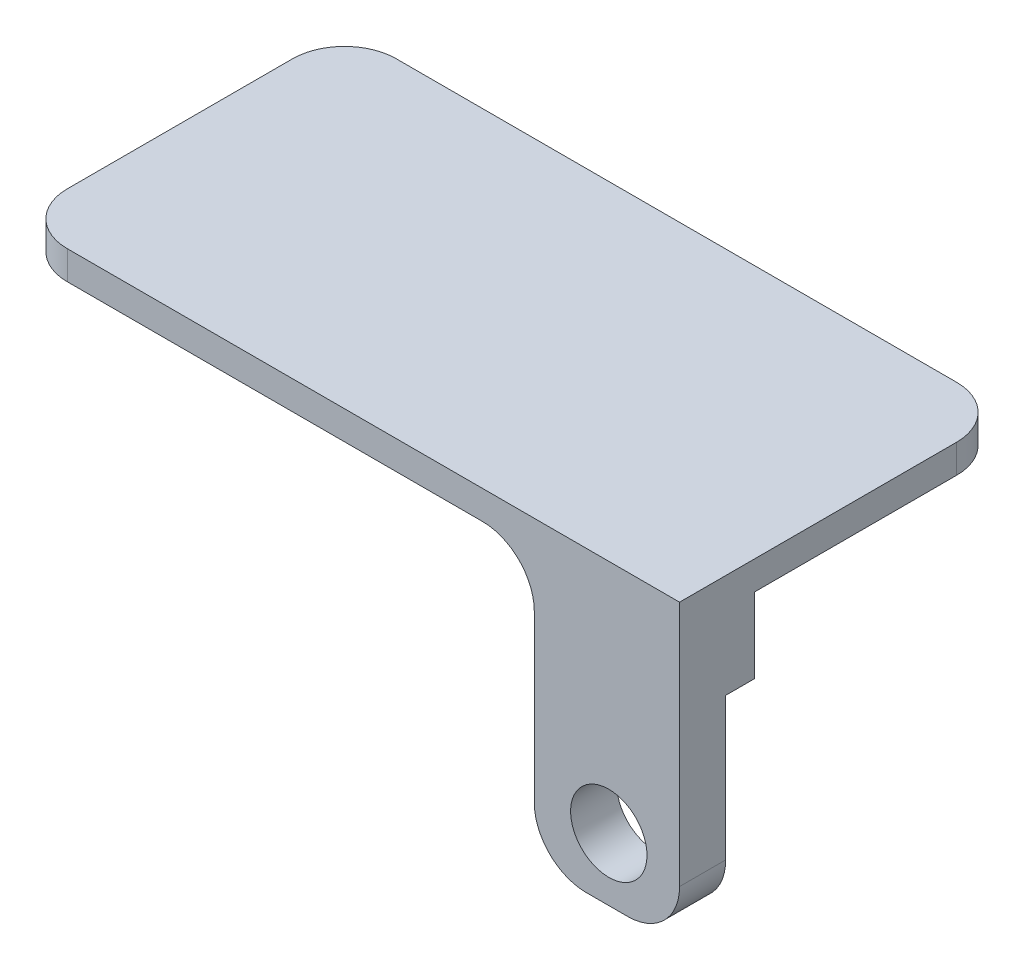
ISO-10303-21;
HEADER;
FILE_DESCRIPTION(('STEP AP214'),'2;1');
FILE_NAME('part.step','',(''),(''),'','','');
FILE_SCHEMA(('AUTOMOTIVE_DESIGN { 1 0 10303 214 1 1 1 1 }'));
ENDSEC;
DATA;
#1=APPLICATION_CONTEXT('core data for automotive mechanical design processes');
#2=APPLICATION_PROTOCOL_DEFINITION('international standard','automotive_design',2000,#1);
#3=PRODUCT_CONTEXT('',#1,'mechanical');
#4=PRODUCT('Part','Part','',(#3));
#5=PRODUCT_RELATED_PRODUCT_CATEGORY('part','',(#4));
#6=PRODUCT_DEFINITION_FORMATION('','',#4);
#7=PRODUCT_DEFINITION_CONTEXT('part definition',#1,'design');
#8=PRODUCT_DEFINITION('design','',#6,#7);
#9=PRODUCT_DEFINITION_SHAPE('','',#8);
#10=(LENGTH_UNIT() NAMED_UNIT(*) SI_UNIT(.MILLI.,.METRE.));
#11=(NAMED_UNIT(*) PLANE_ANGLE_UNIT() SI_UNIT($,.RADIAN.));
#12=(NAMED_UNIT(*) SI_UNIT($,.STERADIAN.) SOLID_ANGLE_UNIT());
#13=UNCERTAINTY_MEASURE_WITH_UNIT(LENGTH_MEASURE(1.E-05),#10,'distance_accuracy_value','');
#14=(GEOMETRIC_REPRESENTATION_CONTEXT(3) GLOBAL_UNCERTAINTY_ASSIGNED_CONTEXT((#13)) GLOBAL_UNIT_ASSIGNED_CONTEXT((#10,
#11,#12)) REPRESENTATION_CONTEXT('',''));
#15=CARTESIAN_POINT('',(0.,0.,0.));
#16=DIRECTION('',(0.,0.,1.));
#17=DIRECTION('',(1.,0.,0.));
#18=AXIS2_PLACEMENT_3D('',#15,#16,#17);
#19=CARTESIAN_POINT('',(-14.,0.,0.));
#20=DIRECTION('',(1.,0.,0.));
#21=DIRECTION('',(0.,0.,-1.));
#22=AXIS2_PLACEMENT_3D('',#19,#20,#21);
#23=PLANE('',#22);
#24=DIRECTION('',(0.,1.,0.));
#25=VECTOR('',#24,1.);
#26=CARTESIAN_POINT('',(-14.,57.2443307684305,-35.560727186157));
#27=LINE('',#26,#25);
#28=CARTESIAN_POINT('',(-14.,62.2443307684305,-35.560727186157));
#29=VERTEX_POINT('',#28);
#30=CARTESIAN_POINT('',(-14.,75.9782577124047,-35.560727186157));
#31=VERTEX_POINT('',#30);
#32=EDGE_CURVE('E141',#29,#31,#27,.T.);
#33=ORIENTED_EDGE('',*,*,#32,.F.);
#34=DIRECTION('',(0.,0.,-1.));
#35=VECTOR('',#34,1.);
#36=CARTESIAN_POINT('',(-14.,62.2443307684305,-31.1164269881325));
#37=LINE('',#36,#35);
#38=CARTESIAN_POINT('',(-14.,62.2443307684305,-31.1164269881325));
#39=VERTEX_POINT('',#38);
#40=EDGE_CURVE('E54',#29,#39,#37,.F.);
#41=ORIENTED_EDGE('',*,*,#40,.T.);
#42=DIRECTION('',(0.,-1.,0.));
#43=VECTOR('',#42,1.);
#44=CARTESIAN_POINT('',(-14.,85.9782577124047,-31.1164269881325));
#45=LINE('',#44,#43);
#46=CARTESIAN_POINT('',(-14.,78.2163658498492,-31.1164269881325));
#47=VERTEX_POINT('',#46);
#48=EDGE_CURVE('E163',#47,#39,#45,.T.);
#49=ORIENTED_EDGE('',*,*,#48,.F.);
#50=DIRECTION('',(0.,0.,1.));
#51=VECTOR('',#50,1.);
#52=CARTESIAN_POINT('',(-14.,78.2163658498492,0.));
#53=LINE('',#52,#51);
#54=CARTESIAN_POINT('',(-14.,78.2163658498492,-38.3498512377335));
#55=VERTEX_POINT('',#54);
#56=EDGE_CURVE('E48',#47,#55,#53,.F.);
#57=ORIENTED_EDGE('',*,*,#56,.T.);
#58=DIRECTION('',(0.,1.,0.));
#59=VECTOR('',#58,1.);
#60=CARTESIAN_POINT('',(-14.,75.9782577124047,-38.3498512377335));
#61=LINE('',#60,#59);
#62=CARTESIAN_POINT('',(-14.,75.9782577124047,-38.3498512377335));
#63=VERTEX_POINT('',#62);
#64=EDGE_CURVE('E161',#63,#55,#61,.T.);
#65=ORIENTED_EDGE('',*,*,#64,.F.);
#66=DIRECTION('',(0.,0.,-1.));
#67=VECTOR('',#66,1.);
#68=CARTESIAN_POINT('',(-14.,75.9782577124047,-35.560727186157));
#69=LINE('',#68,#67);
#70=EDGE_CURVE('E150',#31,#63,#69,.T.);
#71=ORIENTED_EDGE('',*,*,#70,.F.);
#72=EDGE_LOOP('',(#33,#41,#49,#57,#65,#71));
#73=FACE_BOUND('',#72,.T.);
#74=ADVANCED_FACE('F33',(#73),#23,.F.);
#75=CARTESIAN_POINT('',(-14.,57.2443307684305,-35.560727186157));
#76=DIRECTION('',(0.,-1.,0.));
#77=DIRECTION('',(0.,0.,-1.));
#78=AXIS2_PLACEMENT_3D('',#75,#76,#77);
#79=PLANE('',#78);
#80=DIRECTION('',(1.,0.,0.));
#81=VECTOR('',#80,1.);
#82=CARTESIAN_POINT('',(-14.,57.2443307684305,-35.560727186157));
#83=LINE('',#82,#81);
#84=CARTESIAN_POINT('',(-9.,57.2443307684305,-35.560727186157));
#85=VERTEX_POINT('',#84);
#86=CARTESIAN_POINT('',(-5.,57.2443307684305,-35.560727186157));
#87=VERTEX_POINT('',#86);
#88=EDGE_CURVE('E159',#85,#87,#83,.T.);
#89=ORIENTED_EDGE('',*,*,#88,.T.);
#90=DIRECTION('',(0.,0.,-1.));
#91=VECTOR('',#90,1.);
#92=CARTESIAN_POINT('',(-5.,57.2443307684305,-35.560727186157));
#93=LINE('',#92,#91);
#94=CARTESIAN_POINT('',(-5.,57.2443307684305,-31.1164269881325));
#95=VERTEX_POINT('',#94);
#96=EDGE_CURVE('E174',#87,#95,#93,.F.);
#97=ORIENTED_EDGE('',*,*,#96,.T.);
#98=DIRECTION('',(1.,0.,0.));
#99=VECTOR('',#98,1.);
#100=CARTESIAN_POINT('',(-14.,57.2443307684305,-31.1164269881325));
#101=LINE('',#100,#99);
#102=CARTESIAN_POINT('',(-9.,57.2443307684305,-31.1164269881325));
#103=VERTEX_POINT('',#102);
#104=EDGE_CURVE('E254',#103,#95,#101,.T.);
#105=ORIENTED_EDGE('',*,*,#104,.F.);
#106=DIRECTION('',(0.,0.,-1.));
#107=VECTOR('',#106,1.);
#108=CARTESIAN_POINT('',(-9.,57.2443307684305,-35.560727186157));
#109=LINE('',#108,#107);
#110=EDGE_CURVE('E247',#103,#85,#109,.T.);
#111=ORIENTED_EDGE('',*,*,#110,.T.);
#112=EDGE_LOOP('',(#89,#97,#105,#111));
#113=FACE_BOUND('',#112,.T.);
#114=ADVANCED_FACE('F253',(#113),#79,.T.);
#115=CARTESIAN_POINT('',(-14.,85.9782577124047,-31.1164269881325));
#116=DIRECTION('',(0.,0.,1.));
#117=DIRECTION('',(1.,0.,0.));
#118=AXIS2_PLACEMENT_3D('',#115,#116,#117);
#119=PLANE('',#118);
#120=CARTESIAN_POINT('',(-6.81927464086296,63.2782577124047,-31.1164269881325));
#121=DIRECTION('',(0.,0.,1.));
#122=DIRECTION('',(1.,0.,0.));
#123=AXIS2_PLACEMENT_3D('',#120,#121,#122);
#124=CIRCLE('',#123,3.67999999999998);
#125=CARTESIAN_POINT('',(-3.13927464086298,63.2782577124047,-31.1164269881325));
#126=VERTEX_POINT('',#125);
#127=EDGE_CURVE('E213',#126,#126,#124,.T.);
#128=ORIENTED_EDGE('',*,*,#127,.F.);
#129=EDGE_LOOP('',(#128));
#130=FACE_BOUND('',#129,.T.);
#131=ORIENTED_EDGE('',*,*,#104,.T.);
#132=CARTESIAN_POINT('',(-5.,62.2443307684305,-31.1164269881325));
#133=DIRECTION('',(0.,0.,1.));
#134=DIRECTION('',(1.,0.,0.));
#135=AXIS2_PLACEMENT_3D('',#132,#133,#134);
#136=CIRCLE('',#135,5.);
#137=CARTESIAN_POINT('',(0.,62.2443307684305,-31.1164269881325));
#138=VERTEX_POINT('',#137);
#139=EDGE_CURVE('E180',#95,#138,#136,.T.);
#140=ORIENTED_EDGE('',*,*,#139,.T.);
#141=DIRECTION('',(0.,-1.,0.));
#142=VECTOR('',#141,1.);
#143=CARTESIAN_POINT('',(0.,85.9782577124047,-31.1164269881325));
#144=LINE('',#143,#142);
#145=CARTESIAN_POINT('',(0.,85.9782577124047,-31.1164269881325));
#146=VERTEX_POINT('',#145);
#147=EDGE_CURVE('E151',#146,#138,#144,.T.);
#148=ORIENTED_EDGE('',*,*,#147,.F.);
#149=DIRECTION('',(1.,0.,0.));
#150=VECTOR('',#149,1.);
#151=CARTESIAN_POINT('',(-14.,85.9782577124047,-31.1164269881325));
#152=LINE('',#151,#150);
#153=CARTESIAN_POINT('',(-59.,85.9782577124047,-31.1164269881325));
#154=VERTEX_POINT('',#153);
#155=EDGE_CURVE('E260',#154,#146,#152,.T.);
#156=ORIENTED_EDGE('',*,*,#155,.F.);
#157=DIRECTION('',(0.,1.,0.));
#158=VECTOR('',#157,1.);
#159=CARTESIAN_POINT('',(-59.,83.2163658498492,-31.1164269881325));
#160=LINE('',#159,#158);
#161=CARTESIAN_POINT('',(-59.,83.2163658498492,-31.1164269881325));
#162=VERTEX_POINT('',#161);
#163=EDGE_CURVE('E176',#154,#162,#160,.F.);
#164=ORIENTED_EDGE('',*,*,#163,.T.);
#165=DIRECTION('',(1.,0.,0.));
#166=VECTOR('',#165,1.);
#167=CARTESIAN_POINT('',(-64.,83.2163658498492,-31.1164269881325));
#168=LINE('',#167,#166);
#169=CARTESIAN_POINT('',(-19.,83.2163658498492,-31.1164269881325));
#170=VERTEX_POINT('',#169);
#171=EDGE_CURVE('E189',#162,#170,#168,.T.);
#172=ORIENTED_EDGE('',*,*,#171,.T.);
#173=CARTESIAN_POINT('',(-19.,78.2163658498492,-31.1164269881325));
#174=DIRECTION('',(0.,0.,1.));
#175=DIRECTION('',(1.,0.,0.));
#176=AXIS2_PLACEMENT_3D('',#173,#174,#175);
#177=CIRCLE('',#176,5.);
#178=EDGE_CURVE('E41',#170,#47,#177,.F.);
#179=ORIENTED_EDGE('',*,*,#178,.T.);
#180=ORIENTED_EDGE('',*,*,#48,.T.);
#181=CARTESIAN_POINT('',(-9.,62.2443307684305,-31.1164269881325));
#182=DIRECTION('',(0.,0.,1.));
#183=DIRECTION('',(1.,0.,0.));
#184=AXIS2_PLACEMENT_3D('',#181,#182,#183);
#185=CIRCLE('',#184,5.);
#186=EDGE_CURVE('E178',#39,#103,#185,.T.);
#187=ORIENTED_EDGE('',*,*,#186,.T.);
#188=EDGE_LOOP('',(#131,#140,#148,#156,#164,#172,#179,#180,#187));
#189=FACE_BOUND('',#188,.T.);
#190=ADVANCED_FACE('F186',(#130,#189),#119,.T.);
#191=CARTESIAN_POINT('',(-14.,85.9782577124047,-62.8189346250314));
#192=DIRECTION('',(0.,1.,0.));
#193=DIRECTION('',(0.,0.,1.));
#194=AXIS2_PLACEMENT_3D('',#191,#192,#193);
#195=PLANE('',#194);
#196=DIRECTION('',(1.,0.,0.));
#197=VECTOR('',#196,1.);
#198=CARTESIAN_POINT('',(-14.,85.9782577124047,-62.8189346250314));
#199=LINE('',#198,#197);
#200=CARTESIAN_POINT('',(-59.,85.9782577124047,-62.8189346250314));
#201=VERTEX_POINT('',#200);
#202=CARTESIAN_POINT('',(-5.,85.9782577124047,-62.8189346250314));
#203=VERTEX_POINT('',#202);
#204=EDGE_CURVE('E275',#201,#203,#199,.T.);
#205=ORIENTED_EDGE('',*,*,#204,.F.);
#206=CARTESIAN_POINT('',(-59.,85.9782577124047,-57.8189346250314));
#207=DIRECTION('',(0.,1.,0.));
#208=DIRECTION('',(0.,0.,1.));
#209=AXIS2_PLACEMENT_3D('',#206,#207,#208);
#210=CIRCLE('',#209,5.);
#211=CARTESIAN_POINT('',(-64.,85.9782577124047,-57.8189346250314));
#212=VERTEX_POINT('',#211);
#213=EDGE_CURVE('E237',#201,#212,#210,.T.);
#214=ORIENTED_EDGE('',*,*,#213,.T.);
#215=DIRECTION('',(0.,0.,-1.));
#216=VECTOR('',#215,1.);
#217=CARTESIAN_POINT('',(-64.,85.9782577124047,-31.1164269881325));
#218=LINE('',#217,#216);
#219=CARTESIAN_POINT('',(-64.,85.9782577124047,-36.1164269881325));
#220=VERTEX_POINT('',#219);
#221=EDGE_CURVE('E307',#220,#212,#218,.T.);
#222=ORIENTED_EDGE('',*,*,#221,.F.);
#223=CARTESIAN_POINT('',(-59.,85.9782577124047,-36.1164269881325));
#224=DIRECTION('',(0.,1.,0.));
#225=DIRECTION('',(0.,0.,1.));
#226=AXIS2_PLACEMENT_3D('',#223,#224,#225);
#227=CIRCLE('',#226,5.);
#228=EDGE_CURVE('E233',#220,#154,#227,.T.);
#229=ORIENTED_EDGE('',*,*,#228,.T.);
#230=ORIENTED_EDGE('',*,*,#155,.T.);
#231=DIRECTION('',(0.,0.,1.));
#232=VECTOR('',#231,1.);
#233=CARTESIAN_POINT('',(0.,85.9782577124047,-62.8189346250314));
#234=LINE('',#233,#232);
#235=CARTESIAN_POINT('',(0.,85.9782577124047,-57.8189346250314));
#236=VERTEX_POINT('',#235);
#237=EDGE_CURVE('E272',#236,#146,#234,.T.);
#238=ORIENTED_EDGE('',*,*,#237,.F.);
#239=CARTESIAN_POINT('',(-5.,85.9782577124047,-57.8189346250314));
#240=DIRECTION('',(0.,1.,0.));
#241=DIRECTION('',(0.,0.,1.));
#242=AXIS2_PLACEMENT_3D('',#239,#240,#241);
#243=CIRCLE('',#242,5.);
#244=EDGE_CURVE('E235',#236,#203,#243,.T.);
#245=ORIENTED_EDGE('',*,*,#244,.T.);
#246=EDGE_LOOP('',(#205,#214,#222,#229,#230,#238,#245));
#247=FACE_BOUND('',#246,.T.);
#248=ADVANCED_FACE('F292',(#247),#195,.T.);
#249=CARTESIAN_POINT('',(-14.,83.2163658498492,-62.8189346250314));
#250=DIRECTION('',(0.,0.,-1.));
#251=DIRECTION('',(-1.,0.,0.));
#252=AXIS2_PLACEMENT_3D('',#249,#250,#251);
#253=PLANE('',#252);
#254=DIRECTION('',(1.,0.,0.));
#255=VECTOR('',#254,1.);
#256=CARTESIAN_POINT('',(-14.,83.2163658498492,-62.8189346250314));
#257=LINE('',#256,#255);
#258=CARTESIAN_POINT('',(-59.,83.2163658498492,-62.8189346250314));
#259=VERTEX_POINT('',#258);
#260=CARTESIAN_POINT('',(-5.,83.2163658498492,-62.8189346250314));
#261=VERTEX_POINT('',#260);
#262=EDGE_CURVE('E203',#259,#261,#257,.T.);
#263=ORIENTED_EDGE('',*,*,#262,.F.);
#264=DIRECTION('',(0.,-1.,0.));
#265=VECTOR('',#264,1.);
#266=CARTESIAN_POINT('',(-59.,85.9782577124047,-62.8189346250314));
#267=LINE('',#266,#265);
#268=EDGE_CURVE('E231',#259,#201,#267,.F.);
#269=ORIENTED_EDGE('',*,*,#268,.T.);
#270=ORIENTED_EDGE('',*,*,#204,.T.);
#271=DIRECTION('',(0.,1.,0.));
#272=VECTOR('',#271,1.);
#273=CARTESIAN_POINT('',(-5.,83.2163658498492,-62.8189346250314));
#274=LINE('',#273,#272);
#275=EDGE_CURVE('E229',#203,#261,#274,.F.);
#276=ORIENTED_EDGE('',*,*,#275,.T.);
#277=EDGE_LOOP('',(#263,#269,#270,#276));
#278=FACE_BOUND('',#277,.T.);
#279=ADVANCED_FACE('F321',(#278),#253,.T.);
#280=CARTESIAN_POINT('',(-14.,83.2163658498492,-38.3498512377335));
#281=DIRECTION('',(0.,-1.,0.));
#282=DIRECTION('',(0.,0.,-1.));
#283=AXIS2_PLACEMENT_3D('',#280,#281,#282);
#284=PLANE('',#283);
#285=DIRECTION('',(0.,0.,1.));
#286=VECTOR('',#285,1.);
#287=CARTESIAN_POINT('',(-64.,83.2163658498492,-31.1164269881325));
#288=LINE('',#287,#286);
#289=CARTESIAN_POINT('',(-64.,83.2163658498492,-57.8189346250314));
#290=VERTEX_POINT('',#289);
#291=CARTESIAN_POINT('',(-64.,83.2163658498492,-36.1164269881325));
#292=VERTEX_POINT('',#291);
#293=EDGE_CURVE('E219',#290,#292,#288,.T.);
#294=ORIENTED_EDGE('',*,*,#293,.F.);
#295=CARTESIAN_POINT('',(-59.,83.2163658498492,-57.8189346250314));
#296=DIRECTION('',(0.,-1.,0.));
#297=DIRECTION('',(0.,0.,-1.));
#298=AXIS2_PLACEMENT_3D('',#295,#296,#297);
#299=CIRCLE('',#298,5.);
#300=EDGE_CURVE('E227',#290,#259,#299,.T.);
#301=ORIENTED_EDGE('',*,*,#300,.T.);
#302=ORIENTED_EDGE('',*,*,#262,.T.);
#303=CARTESIAN_POINT('',(-5.,83.2163658498492,-57.8189346250314));
#304=DIRECTION('',(0.,-1.,0.));
#305=DIRECTION('',(0.,0.,-1.));
#306=AXIS2_PLACEMENT_3D('',#303,#304,#305);
#307=CIRCLE('',#306,5.);
#308=CARTESIAN_POINT('',(0.,83.2163658498492,-57.8189346250314));
#309=VERTEX_POINT('',#308);
#310=EDGE_CURVE('E225',#261,#309,#307,.T.);
#311=ORIENTED_EDGE('',*,*,#310,.T.);
#312=DIRECTION('',(0.,0.,-1.));
#313=VECTOR('',#312,1.);
#314=CARTESIAN_POINT('',(0.,83.2163658498492,-38.3498512377335));
#315=LINE('',#314,#313);
#316=CARTESIAN_POINT('',(0.,83.2163658498492,-38.3498512377335));
#317=VERTEX_POINT('',#316);
#318=EDGE_CURVE('E268',#317,#309,#315,.T.);
#319=ORIENTED_EDGE('',*,*,#318,.F.);
#320=DIRECTION('',(1.,0.,0.));
#321=VECTOR('',#320,1.);
#322=CARTESIAN_POINT('',(-14.,83.2163658498492,-38.3498512377335));
#323=LINE('',#322,#321);
#324=CARTESIAN_POINT('',(-19.,83.2163658498492,-38.3498512377335));
#325=VERTEX_POINT('',#324);
#326=EDGE_CURVE('E198',#325,#317,#323,.T.);
#327=ORIENTED_EDGE('',*,*,#326,.F.);
#328=DIRECTION('',(0.,0.,1.));
#329=VECTOR('',#328,1.);
#330=CARTESIAN_POINT('',(-19.,83.2163658498492,-38.3498512377335));
#331=LINE('',#330,#329);
#332=EDGE_CURVE('E194',#325,#170,#331,.T.);
#333=ORIENTED_EDGE('',*,*,#332,.T.);
#334=ORIENTED_EDGE('',*,*,#171,.F.);
#335=CARTESIAN_POINT('',(-59.,83.2163658498492,-36.1164269881325));
#336=DIRECTION('',(0.,-1.,0.));
#337=DIRECTION('',(0.,0.,-1.));
#338=AXIS2_PLACEMENT_3D('',#335,#336,#337);
#339=CIRCLE('',#338,5.);
#340=EDGE_CURVE('E223',#162,#292,#339,.T.);
#341=ORIENTED_EDGE('',*,*,#340,.T.);
#342=EDGE_LOOP('',(#294,#301,#302,#311,#319,#327,#333,#334,#341));
#343=FACE_BOUND('',#342,.T.);
#344=ADVANCED_FACE('F285',(#343),#284,.T.);
#345=CARTESIAN_POINT('',(-14.,75.9782577124047,-38.3498512377335));
#346=DIRECTION('',(0.,0.,-1.));
#347=DIRECTION('',(-1.,0.,0.));
#348=AXIS2_PLACEMENT_3D('',#345,#346,#347);
#349=PLANE('',#348);
#350=DIRECTION('',(0.,1.,0.));
#351=VECTOR('',#350,1.);
#352=CARTESIAN_POINT('',(0.,75.9782577124047,-38.3498512377335));
#353=LINE('',#352,#351);
#354=CARTESIAN_POINT('',(0.,75.9782577124047,-38.3498512377335));
#355=VERTEX_POINT('',#354);
#356=EDGE_CURVE('E201',#355,#317,#353,.T.);
#357=ORIENTED_EDGE('',*,*,#356,.F.);
#358=DIRECTION('',(1.,0.,0.));
#359=VECTOR('',#358,1.);
#360=CARTESIAN_POINT('',(-14.,75.9782577124047,-38.3498512377335));
#361=LINE('',#360,#359);
#362=EDGE_CURVE('E158',#63,#355,#361,.T.);
#363=ORIENTED_EDGE('',*,*,#362,.F.);
#364=ORIENTED_EDGE('',*,*,#64,.T.);
#365=CARTESIAN_POINT('',(-19.,78.2163658498492,-38.3498512377335));
#366=DIRECTION('',(0.,0.,-1.));
#367=DIRECTION('',(-1.,0.,0.));
#368=AXIS2_PLACEMENT_3D('',#365,#366,#367);
#369=CIRCLE('',#368,5.);
#370=EDGE_CURVE('E11',#55,#325,#369,.F.);
#371=ORIENTED_EDGE('',*,*,#370,.T.);
#372=ORIENTED_EDGE('',*,*,#326,.T.);
#373=EDGE_LOOP('',(#357,#363,#364,#371,#372));
#374=FACE_BOUND('',#373,.T.);
#375=ADVANCED_FACE('F197',(#374),#349,.T.);
#376=CARTESIAN_POINT('',(-14.,75.9782577124047,-35.560727186157));
#377=DIRECTION('',(0.,-1.,0.));
#378=DIRECTION('',(0.,0.,-1.));
#379=AXIS2_PLACEMENT_3D('',#376,#377,#378);
#380=PLANE('',#379);
#381=DIRECTION('',(0.,0.,-1.));
#382=VECTOR('',#381,1.);
#383=CARTESIAN_POINT('',(0.,75.9782577124047,-35.560727186157));
#384=LINE('',#383,#382);
#385=CARTESIAN_POINT('',(0.,75.9782577124047,-35.560727186157));
#386=VERTEX_POINT('',#385);
#387=EDGE_CURVE('E157',#386,#355,#384,.T.);
#388=ORIENTED_EDGE('',*,*,#387,.F.);
#389=DIRECTION('',(1.,0.,0.));
#390=VECTOR('',#389,1.);
#391=CARTESIAN_POINT('',(-14.,75.9782577124047,-35.560727186157));
#392=LINE('',#391,#390);
#393=EDGE_CURVE('E145',#31,#386,#392,.T.);
#394=ORIENTED_EDGE('',*,*,#393,.F.);
#395=ORIENTED_EDGE('',*,*,#70,.T.);
#396=ORIENTED_EDGE('',*,*,#362,.T.);
#397=EDGE_LOOP('',(#388,#394,#395,#396));
#398=FACE_BOUND('',#397,.T.);
#399=ADVANCED_FACE('F155',(#398),#380,.T.);
#400=CARTESIAN_POINT('',(-14.,57.2443307684305,-35.560727186157));
#401=DIRECTION('',(0.,0.,-1.));
#402=DIRECTION('',(-1.,0.,0.));
#403=AXIS2_PLACEMENT_3D('',#400,#401,#402);
#404=PLANE('',#403);
#405=CARTESIAN_POINT('',(-6.81927464086296,63.2782577124047,-35.560727186157));
#406=DIRECTION('',(0.,0.,-1.));
#407=DIRECTION('',(-1.,0.,0.));
#408=AXIS2_PLACEMENT_3D('',#405,#406,#407);
#409=CIRCLE('',#408,3.67999999999998);
#410=CARTESIAN_POINT('',(-10.4992746408629,63.2782577124047,-35.560727186157));
#411=VERTEX_POINT('',#410);
#412=EDGE_CURVE('E210',#411,#411,#409,.T.);
#413=ORIENTED_EDGE('',*,*,#412,.F.);
#414=EDGE_LOOP('',(#413));
#415=FACE_BOUND('',#414,.T.);
#416=DIRECTION('',(0.,1.,0.));
#417=VECTOR('',#416,1.);
#418=CARTESIAN_POINT('',(0.,57.2443307684305,-35.560727186157));
#419=LINE('',#418,#417);
#420=CARTESIAN_POINT('',(0.,62.2443307684305,-35.560727186157));
#421=VERTEX_POINT('',#420);
#422=EDGE_CURVE('E169',#421,#386,#419,.T.);
#423=ORIENTED_EDGE('',*,*,#422,.F.);
#424=CARTESIAN_POINT('',(-5.,62.2443307684305,-35.560727186157));
#425=DIRECTION('',(0.,0.,-1.));
#426=DIRECTION('',(-1.,0.,0.));
#427=AXIS2_PLACEMENT_3D('',#424,#425,#426);
#428=CIRCLE('',#427,5.);
#429=EDGE_CURVE('E246',#421,#87,#428,.T.);
#430=ORIENTED_EDGE('',*,*,#429,.T.);
#431=ORIENTED_EDGE('',*,*,#88,.F.);
#432=CARTESIAN_POINT('',(-9.,62.2443307684305,-35.560727186157));
#433=DIRECTION('',(0.,0.,-1.));
#434=DIRECTION('',(-1.,0.,0.));
#435=AXIS2_PLACEMENT_3D('',#432,#433,#434);
#436=CIRCLE('',#435,5.);
#437=EDGE_CURVE('E148',#85,#29,#436,.T.);
#438=ORIENTED_EDGE('',*,*,#437,.T.);
#439=ORIENTED_EDGE('',*,*,#32,.T.);
#440=ORIENTED_EDGE('',*,*,#393,.T.);
#441=EDGE_LOOP('',(#423,#430,#431,#438,#439,#440));
#442=FACE_BOUND('',#441,.T.);
#443=ADVANCED_FACE('F144',(#415,#442),#404,.T.);
#444=CARTESIAN_POINT('',(0.,0.,0.));
#445=DIRECTION('',(1.,0.,0.));
#446=DIRECTION('',(0.,0.,-1.));
#447=AXIS2_PLACEMENT_3D('',#444,#445,#446);
#448=PLANE('',#447);
#449=ORIENTED_EDGE('',*,*,#318,.T.);
#450=DIRECTION('',(0.,1.,0.));
#451=VECTOR('',#450,1.);
#452=CARTESIAN_POINT('',(0.,0.,-57.8189346250314));
#453=LINE('',#452,#451);
#454=EDGE_CURVE('E242',#309,#236,#453,.T.);
#455=ORIENTED_EDGE('',*,*,#454,.T.);
#456=ORIENTED_EDGE('',*,*,#237,.T.);
#457=ORIENTED_EDGE('',*,*,#147,.T.);
#458=DIRECTION('',(0.,0.,-1.));
#459=VECTOR('',#458,1.);
#460=CARTESIAN_POINT('',(0.,62.2443307684305,0.));
#461=LINE('',#460,#459);
#462=EDGE_CURVE('E239',#138,#421,#461,.T.);
#463=ORIENTED_EDGE('',*,*,#462,.T.);
#464=ORIENTED_EDGE('',*,*,#422,.T.);
#465=ORIENTED_EDGE('',*,*,#387,.T.);
#466=ORIENTED_EDGE('',*,*,#356,.T.);
#467=EDGE_LOOP('',(#449,#455,#456,#457,#463,#464,#465,#466));
#468=FACE_BOUND('',#467,.T.);
#469=ADVANCED_FACE('F266',(#468),#448,.T.);
#470=CARTESIAN_POINT('',(-6.81927464086296,63.2782577124047,-41.1164269881325));
#471=DIRECTION('',(0.,0.,1.));
#472=DIRECTION('',(1.,0.,0.));
#473=AXIS2_PLACEMENT_3D('',#470,#471,#472);
#474=CYLINDRICAL_SURFACE('',#473,3.67999999999998);
#475=ORIENTED_EDGE('',*,*,#412,.T.);
#476=EDGE_LOOP('',(#475));
#477=FACE_BOUND('',#476,.T.);
#478=ORIENTED_EDGE('',*,*,#127,.T.);
#479=EDGE_LOOP('',(#478));
#480=FACE_BOUND('',#479,.T.);
#481=ADVANCED_FACE('F313',(#477,#480),#474,.F.);
#482=CARTESIAN_POINT('',(-64.,0.,0.));
#483=DIRECTION('',(1.,0.,0.));
#484=DIRECTION('',(0.,0.,-1.));
#485=AXIS2_PLACEMENT_3D('',#482,#483,#484);
#486=PLANE('',#485);
#487=ORIENTED_EDGE('',*,*,#221,.T.);
#488=DIRECTION('',(0.,-1.,0.));
#489=VECTOR('',#488,1.);
#490=CARTESIAN_POINT('',(-64.,83.2163658498492,-57.8189346250314));
#491=LINE('',#490,#489);
#492=EDGE_CURVE('E220',#212,#290,#491,.T.);
#493=ORIENTED_EDGE('',*,*,#492,.T.);
#494=ORIENTED_EDGE('',*,*,#293,.T.);
#495=DIRECTION('',(0.,1.,0.));
#496=VECTOR('',#495,1.);
#497=CARTESIAN_POINT('',(-64.,85.9782577124047,-36.1164269881325));
#498=LINE('',#497,#496);
#499=EDGE_CURVE('E259',#292,#220,#498,.T.);
#500=ORIENTED_EDGE('',*,*,#499,.T.);
#501=EDGE_LOOP('',(#487,#493,#494,#500));
#502=FACE_BOUND('',#501,.T.);
#503=ADVANCED_FACE('F305',(#502),#486,.F.);
#504=CARTESIAN_POINT('',(-59.,0.,-57.8189346250314));
#505=DIRECTION('',(0.,1.,0.));
#506=DIRECTION('',(0.,0.,1.));
#507=AXIS2_PLACEMENT_3D('',#504,#505,#506);
#508=CYLINDRICAL_SURFACE('',#507,5.);
#509=ORIENTED_EDGE('',*,*,#213,.F.);
#510=ORIENTED_EDGE('',*,*,#268,.F.);
#511=ORIENTED_EDGE('',*,*,#300,.F.);
#512=ORIENTED_EDGE('',*,*,#492,.F.);
#513=EDGE_LOOP('',(#509,#510,#511,#512));
#514=FACE_BOUND('',#513,.T.);
#515=ADVANCED_FACE('F346',(#514),#508,.T.);
#516=CARTESIAN_POINT('',(-5.,0.,-57.8189346250314));
#517=DIRECTION('',(0.,1.,0.));
#518=DIRECTION('',(0.,0.,1.));
#519=AXIS2_PLACEMENT_3D('',#516,#517,#518);
#520=CYLINDRICAL_SURFACE('',#519,5.);
#521=ORIENTED_EDGE('',*,*,#310,.F.);
#522=ORIENTED_EDGE('',*,*,#275,.F.);
#523=ORIENTED_EDGE('',*,*,#244,.F.);
#524=ORIENTED_EDGE('',*,*,#454,.F.);
#525=EDGE_LOOP('',(#521,#522,#523,#524));
#526=FACE_BOUND('',#525,.T.);
#527=ADVANCED_FACE('F289',(#526),#520,.T.);
#528=CARTESIAN_POINT('',(-5.,62.2443307684305,0.));
#529=DIRECTION('',(0.,0.,-1.));
#530=DIRECTION('',(-1.,0.,0.));
#531=AXIS2_PLACEMENT_3D('',#528,#529,#530);
#532=CYLINDRICAL_SURFACE('',#531,5.);
#533=ORIENTED_EDGE('',*,*,#139,.F.);
#534=ORIENTED_EDGE('',*,*,#96,.F.);
#535=ORIENTED_EDGE('',*,*,#429,.F.);
#536=ORIENTED_EDGE('',*,*,#462,.F.);
#537=EDGE_LOOP('',(#533,#534,#535,#536));
#538=FACE_BOUND('',#537,.T.);
#539=ADVANCED_FACE('F263',(#538),#532,.T.);
#540=CARTESIAN_POINT('',(-9.,62.2443307684305,-35.560727186157));
#541=DIRECTION('',(0.,0.,1.));
#542=DIRECTION('',(1.,0.,0.));
#543=AXIS2_PLACEMENT_3D('',#540,#541,#542);
#544=CYLINDRICAL_SURFACE('',#543,5.);
#545=ORIENTED_EDGE('',*,*,#186,.F.);
#546=ORIENTED_EDGE('',*,*,#40,.F.);
#547=ORIENTED_EDGE('',*,*,#437,.F.);
#548=ORIENTED_EDGE('',*,*,#110,.F.);
#549=EDGE_LOOP('',(#545,#546,#547,#548));
#550=FACE_BOUND('',#549,.T.);
#551=ADVANCED_FACE('F354',(#550),#544,.T.);
#552=CARTESIAN_POINT('',(-59.,0.,-36.1164269881325));
#553=DIRECTION('',(0.,-1.,0.));
#554=DIRECTION('',(0.,0.,-1.));
#555=AXIS2_PLACEMENT_3D('',#552,#553,#554);
#556=CYLINDRICAL_SURFACE('',#555,5.);
#557=ORIENTED_EDGE('',*,*,#340,.F.);
#558=ORIENTED_EDGE('',*,*,#163,.F.);
#559=ORIENTED_EDGE('',*,*,#228,.F.);
#560=ORIENTED_EDGE('',*,*,#499,.F.);
#561=EDGE_LOOP('',(#557,#558,#559,#560));
#562=FACE_BOUND('',#561,.T.);
#563=ADVANCED_FACE('F298',(#562),#556,.T.);
#564=CARTESIAN_POINT('',(-19.,78.2163658498492,-38.3498512377335));
#565=DIRECTION('',(0.,0.,1.));
#566=DIRECTION('',(1.,0.,0.));
#567=AXIS2_PLACEMENT_3D('',#564,#565,#566);
#568=CYLINDRICAL_SURFACE('',#567,5.);
#569=ORIENTED_EDGE('',*,*,#370,.F.);
#570=ORIENTED_EDGE('',*,*,#56,.F.);
#571=ORIENTED_EDGE('',*,*,#178,.F.);
#572=ORIENTED_EDGE('',*,*,#332,.F.);
#573=EDGE_LOOP('',(#569,#570,#571,#572));
#574=FACE_BOUND('',#573,.T.);
#575=ADVANCED_FACE('F35',(#574),#568,.F.);
#576=CLOSED_SHELL('',(#74,#114,#190,#248,#279,#344,#375,#399,#443,#469,#481,#503,#515,#527,#539,
#551,#563,#575));
#577=MANIFOLD_SOLID_BREP('B2',#576);
#578=ADVANCED_BREP_SHAPE_REPRESENTATION('',(#18,#577),#14);
#579=SHAPE_DEFINITION_REPRESENTATION(#9,#578);
ENDSEC;
END-ISO-10303-21;
